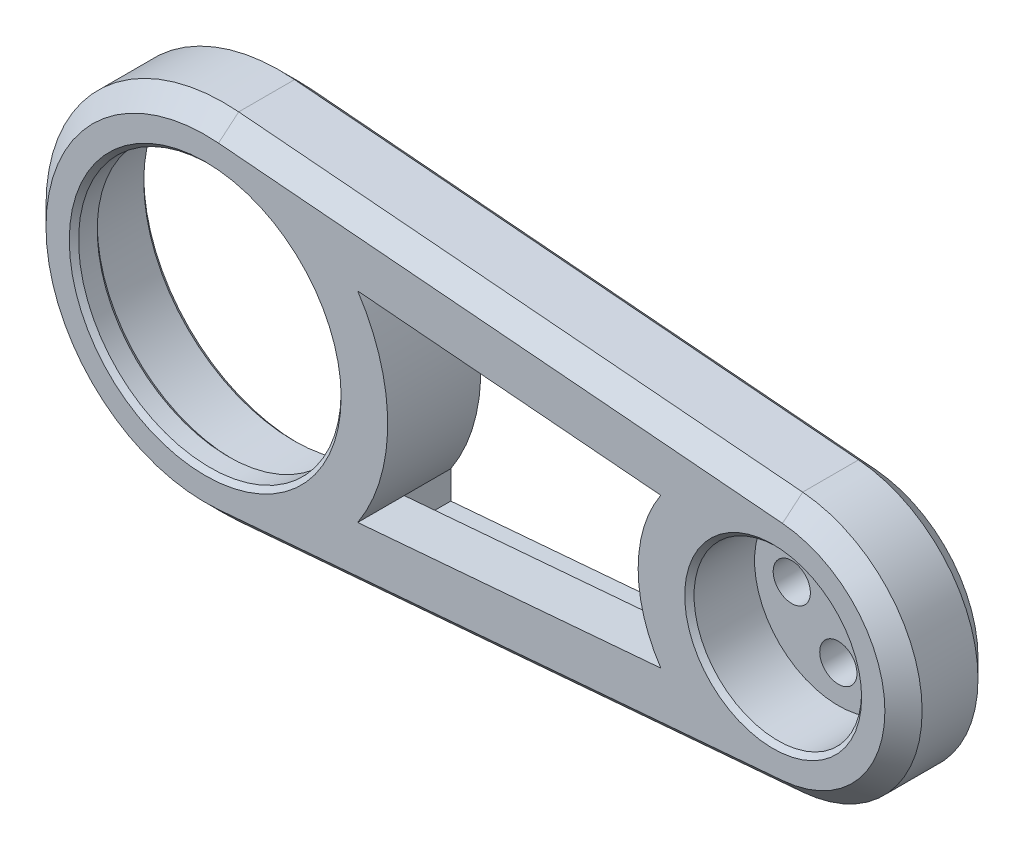
ISO-10303-21;
HEADER;
FILE_DESCRIPTION(('STEP AP214'),'2;1');
FILE_NAME('part.step','',(''),(''),'','','');
FILE_SCHEMA(('AUTOMOTIVE_DESIGN { 1 0 10303 214 1 1 1 1 }'));
ENDSEC;
DATA;
#1=APPLICATION_CONTEXT('core data for automotive mechanical design processes');
#2=APPLICATION_PROTOCOL_DEFINITION('international standard','automotive_design',2000,#1);
#3=PRODUCT_CONTEXT('',#1,'mechanical');
#4=PRODUCT('Part','Part','',(#3));
#5=PRODUCT_RELATED_PRODUCT_CATEGORY('part','',(#4));
#6=PRODUCT_DEFINITION_FORMATION('','',#4);
#7=PRODUCT_DEFINITION_CONTEXT('part definition',#1,'design');
#8=PRODUCT_DEFINITION('design','',#6,#7);
#9=PRODUCT_DEFINITION_SHAPE('','',#8);
#10=(LENGTH_UNIT() NAMED_UNIT(*) SI_UNIT(.MILLI.,.METRE.));
#11=(NAMED_UNIT(*) PLANE_ANGLE_UNIT() SI_UNIT($,.RADIAN.));
#12=(NAMED_UNIT(*) SI_UNIT($,.STERADIAN.) SOLID_ANGLE_UNIT());
#13=UNCERTAINTY_MEASURE_WITH_UNIT(LENGTH_MEASURE(1.E-05),#10,'distance_accuracy_value','');
#14=(GEOMETRIC_REPRESENTATION_CONTEXT(3) GLOBAL_UNCERTAINTY_ASSIGNED_CONTEXT((#13)) GLOBAL_UNIT_ASSIGNED_CONTEXT((#10,
#11,#12)) REPRESENTATION_CONTEXT('',''));
#15=CARTESIAN_POINT('',(0.,0.,0.));
#16=DIRECTION('',(0.,0.,1.));
#17=DIRECTION('',(1.,0.,0.));
#18=AXIS2_PLACEMENT_3D('',#15,#16,#17);
#19=CARTESIAN_POINT('',(1.01163934426229,12.0576359970411,-49.0337822898405));
#20=DIRECTION('',(0.083606557377049,0.996498842730667,0.));
#21=DIRECTION('',(-0.996498842730667,0.083606557377049,0.));
#22=AXIS2_PLACEMENT_3D('',#19,#20,#21);
#23=PLANE('',#22);
#24=DIRECTION('',(-0.996498842730667,0.083606557377049,0.));
#25=VECTOR('',#24,1.);
#26=CARTESIAN_POINT('',(1.01163934426229,12.0576359970411,-5.));
#27=LINE('',#26,#25);
#28=CARTESIAN_POINT('',(48.9312799857841,8.03716350576911,-5.));
#29=VERTEX_POINT('',#28);
#30=CARTESIAN_POINT('',(16.3767984414613,10.7684944540893,-5.));
#31=VERTEX_POINT('',#30);
#32=EDGE_CURVE('E198',#29,#31,#27,.T.);
#33=ORIENTED_EDGE('',*,*,#32,.F.);
#34=DIRECTION('',(0.,0.,1.));
#35=VECTOR('',#34,1.);
#36=CARTESIAN_POINT('',(48.9312799857841,8.03716350576912,-49.0337822898405));
#37=LINE('',#36,#35);
#38=CARTESIAN_POINT('',(48.9312799857841,8.03716350576912,0.));
#39=VERTEX_POINT('',#38);
#40=EDGE_CURVE('E253',#29,#39,#37,.T.);
#41=ORIENTED_EDGE('',*,*,#40,.T.);
#42=DIRECTION('',(-0.996498842730667,0.083606557377049,0.));
#43=VECTOR('',#42,1.);
#44=CARTESIAN_POINT('',(1.01163934426229,12.0576359970411,0.));
#45=LINE('',#44,#43);
#46=CARTESIAN_POINT('',(16.3767984414613,10.7684944540893,0.));
#47=VERTEX_POINT('',#46);
#48=EDGE_CURVE('E232',#39,#47,#45,.T.);
#49=ORIENTED_EDGE('',*,*,#48,.T.);
#50=DIRECTION('',(0.,0.,1.));
#51=VECTOR('',#50,1.);
#52=CARTESIAN_POINT('',(16.3767984414613,10.7684944540893,-49.0337822898405));
#53=LINE('',#52,#51);
#54=EDGE_CURVE('E234',#31,#47,#53,.T.);
#55=ORIENTED_EDGE('',*,*,#54,.F.);
#56=EDGE_LOOP('',(#33,#41,#49,#55));
#57=FACE_BOUND('',#56,.T.);
#58=ADVANCED_FACE('F47',(#57),#23,.F.);
#59=CARTESIAN_POINT('',(1.01163934426229,-12.0576359970411,-49.0337822898405));
#60=DIRECTION('',(0.0836065573770487,-0.996498842730667,0.));
#61=DIRECTION('',(0.996498842730667,0.0836065573770487,0.));
#62=AXIS2_PLACEMENT_3D('',#59,#60,#61);
#63=PLANE('',#62);
#64=DIRECTION('',(0.996498842730667,0.0836065573770487,0.));
#65=VECTOR('',#64,1.);
#66=CARTESIAN_POINT('',(1.01163934426229,-12.0576359970411,-5.));
#67=LINE('',#66,#65);
#68=CARTESIAN_POINT('',(16.3767984414613,-10.7684944540893,-5.));
#69=VERTEX_POINT('',#68);
#70=CARTESIAN_POINT('',(48.9312799857842,-8.03716350576914,-5.));
#71=VERTEX_POINT('',#70);
#72=EDGE_CURVE('E220',#69,#71,#67,.T.);
#73=ORIENTED_EDGE('',*,*,#72,.F.);
#74=DIRECTION('',(0.,0.,1.));
#75=VECTOR('',#74,1.);
#76=CARTESIAN_POINT('',(16.3767984414613,-10.7684944540893,-49.0337822898405));
#77=LINE('',#76,#75);
#78=CARTESIAN_POINT('',(16.3767984414613,-10.7684944540893,0.));
#79=VERTEX_POINT('',#78);
#80=EDGE_CURVE('E260',#69,#79,#77,.T.);
#81=ORIENTED_EDGE('',*,*,#80,.T.);
#82=DIRECTION('',(0.996498842730667,0.0836065573770487,0.));
#83=VECTOR('',#82,1.);
#84=CARTESIAN_POINT('',(1.01163934426229,-12.0576359970411,0.));
#85=LINE('',#84,#83);
#86=CARTESIAN_POINT('',(48.9312799857842,-8.03716350576913,0.));
#87=VERTEX_POINT('',#86);
#88=EDGE_CURVE('E233',#79,#87,#85,.T.);
#89=ORIENTED_EDGE('',*,*,#88,.T.);
#90=DIRECTION('',(0.,0.,1.));
#91=VECTOR('',#90,1.);
#92=CARTESIAN_POINT('',(48.9312799857842,-8.03716350576913,-49.0337822898405));
#93=LINE('',#92,#91);
#94=EDGE_CURVE('E237',#71,#87,#93,.T.);
#95=ORIENTED_EDGE('',*,*,#94,.F.);
#96=EDGE_LOOP('',(#73,#81,#89,#95));
#97=FACE_BOUND('',#96,.T.);
#98=ADVANCED_FACE('F434',(#97),#63,.F.);
#99=CARTESIAN_POINT('',(0.,0.,-7.));
#100=DIRECTION('',(0.,0.,1.));
#101=DIRECTION('',(1.,0.,0.));
#102=AXIS2_PLACEMENT_3D('',#99,#100,#101);
#103=CYLINDRICAL_SURFACE('',#102,16.1);
#104=CARTESIAN_POINT('',(0.,0.,-9.5));
#105=DIRECTION('',(0.,0.,-1.));
#106=DIRECTION('',(-1.,0.,0.));
#107=AXIS2_PLACEMENT_3D('',#104,#105,#106);
#108=CIRCLE('',#107,16.1);
#109=CARTESIAN_POINT('',(-16.1,0.,-9.5));
#110=VERTEX_POINT('',#109);
#111=EDGE_CURVE('E320',#110,#110,#108,.T.);
#112=ORIENTED_EDGE('',*,*,#111,.T.);
#113=EDGE_LOOP('',(#112));
#114=FACE_BOUND('',#113,.T.);
#115=CARTESIAN_POINT('',(0.,0.,-3.));
#116=DIRECTION('',(0.,0.,1.));
#117=DIRECTION('',(1.,0.,0.));
#118=AXIS2_PLACEMENT_3D('',#115,#116,#117);
#119=CIRCLE('',#118,16.1);
#120=CARTESIAN_POINT('',(16.1,0.,-3.));
#121=VERTEX_POINT('',#120);
#122=EDGE_CURVE('E295',#121,#121,#119,.F.);
#123=ORIENTED_EDGE('',*,*,#122,.F.);
#124=EDGE_LOOP('',(#123));
#125=FACE_BOUND('',#124,.T.);
#126=ADVANCED_FACE('F431',(#114,#125),#103,.F.);
#127=CARTESIAN_POINT('',(1.59688524590164,-19.0331278961557,-7.));
#128=DIRECTION('',(0.0836065573770492,-0.996498842730667,0.));
#129=DIRECTION('',(0.996498842730667,0.0836065573770492,0.));
#130=AXIS2_PLACEMENT_3D('',#127,#128,#129);
#131=PLANE('',#130);
#132=DIRECTION('',(0.,0.,1.));
#133=VECTOR('',#132,1.);
#134=CARTESIAN_POINT('',(1.59688524590164,-19.0331278961557,-7.));
#135=LINE('',#134,#133);
#136=CARTESIAN_POINT('',(1.59688524590164,-19.0331278961557,-8.00000000000003));
#137=VERTEX_POINT('',#136);
#138=CARTESIAN_POINT('',(1.59688524590164,-19.0331278961557,-2.));
#139=VERTEX_POINT('',#138);
#140=EDGE_CURVE('E293',#137,#139,#135,.T.);
#141=ORIENTED_EDGE('',*,*,#140,.F.);
#142=DIRECTION('',(0.996498842730667,0.0836065573770492,0.));
#143=VECTOR('',#142,1.);
#144=CARTESIAN_POINT('',(1.59688524590164,-19.0331278961557,-8.00000000000003));
#145=LINE('',#144,#143);
#146=CARTESIAN_POINT('',(62.1704918032787,-13.9509837982293,-8.00000000000003));
#147=VERTEX_POINT('',#146);
#148=EDGE_CURVE('E342',#137,#147,#145,.T.);
#149=ORIENTED_EDGE('',*,*,#148,.T.);
#150=DIRECTION('',(0.,0.,1.));
#151=VECTOR('',#150,1.);
#152=CARTESIAN_POINT('',(62.1704918032787,-13.9509837982293,-7.));
#153=LINE('',#152,#151);
#154=CARTESIAN_POINT('',(62.1704918032787,-13.9509837982293,-2.));
#155=VERTEX_POINT('',#154);
#156=EDGE_CURVE('E286',#147,#155,#153,.T.);
#157=ORIENTED_EDGE('',*,*,#156,.T.);
#158=DIRECTION('',(-0.996498842730667,-0.0836065573770492,0.));
#159=VECTOR('',#158,1.);
#160=CARTESIAN_POINT('',(1.59688524590164,-19.0331278961557,-2.));
#161=LINE('',#160,#159);
#162=EDGE_CURVE('E336',#155,#139,#161,.T.);
#163=ORIENTED_EDGE('',*,*,#162,.T.);
#164=EDGE_LOOP('',(#141,#149,#157,#163));
#165=FACE_BOUND('',#164,.T.);
#166=ADVANCED_FACE('F407',(#165),#131,.T.);
#167=CARTESIAN_POINT('',(0.,0.,-7.));
#168=DIRECTION('',(0.,0.,1.));
#169=DIRECTION('',(1.,0.,0.));
#170=AXIS2_PLACEMENT_3D('',#167,#168,#169);
#171=CYLINDRICAL_SURFACE('',#170,19.1);
#172=DIRECTION('',(0.,0.,1.));
#173=VECTOR('',#172,1.);
#174=CARTESIAN_POINT('',(1.59688524590164,19.0331278961557,-7.));
#175=LINE('',#174,#173);
#176=CARTESIAN_POINT('',(1.59688524590164,19.0331278961557,-8.00000000000003));
#177=VERTEX_POINT('',#176);
#178=CARTESIAN_POINT('',(1.59688524590164,19.0331278961557,-2.));
#179=VERTEX_POINT('',#178);
#180=EDGE_CURVE('E294',#177,#179,#175,.T.);
#181=ORIENTED_EDGE('',*,*,#180,.F.);
#182=CARTESIAN_POINT('',(0.,0.,-8.00000000000003));
#183=DIRECTION('',(0.,0.,-1.));
#184=DIRECTION('',(-1.,0.,0.));
#185=AXIS2_PLACEMENT_3D('',#182,#183,#184);
#186=CIRCLE('',#185,19.1);
#187=EDGE_CURVE('E347',#177,#137,#186,.F.);
#188=ORIENTED_EDGE('',*,*,#187,.T.);
#189=ORIENTED_EDGE('',*,*,#140,.T.);
#190=CARTESIAN_POINT('',(0.,0.,-2.));
#191=DIRECTION('',(0.,0.,1.));
#192=DIRECTION('',(1.,0.,0.));
#193=AXIS2_PLACEMENT_3D('',#190,#191,#192);
#194=CIRCLE('',#193,19.1);
#195=EDGE_CURVE('E341',#139,#179,#194,.F.);
#196=ORIENTED_EDGE('',*,*,#195,.T.);
#197=EDGE_LOOP('',(#181,#188,#189,#196));
#198=FACE_BOUND('',#197,.T.);
#199=ADVANCED_FACE('F421',(#198),#171,.T.);
#200=CARTESIAN_POINT('',(1.59688524590164,19.0331278961557,-7.));
#201=DIRECTION('',(-0.0836065573770492,-0.996498842730667,0.));
#202=DIRECTION('',(0.996498842730667,-0.0836065573770492,0.));
#203=AXIS2_PLACEMENT_3D('',#200,#201,#202);
#204=PLANE('',#203);
#205=DIRECTION('',(0.,0.,1.));
#206=VECTOR('',#205,1.);
#207=CARTESIAN_POINT('',(62.1704918032787,13.9509837982293,-7.));
#208=LINE('',#207,#206);
#209=CARTESIAN_POINT('',(62.1704918032787,13.9509837982293,-8.00000000000003));
#210=VERTEX_POINT('',#209);
#211=CARTESIAN_POINT('',(62.1704918032787,13.9509837982293,-2.));
#212=VERTEX_POINT('',#211);
#213=EDGE_CURVE('E296',#210,#212,#208,.T.);
#214=ORIENTED_EDGE('',*,*,#213,.F.);
#215=DIRECTION('',(-0.996498842730667,0.0836065573770492,0.));
#216=VECTOR('',#215,1.);
#217=CARTESIAN_POINT('',(1.59688524590164,19.0331278961557,-8.00000000000003));
#218=LINE('',#217,#216);
#219=EDGE_CURVE('E351',#210,#177,#218,.T.);
#220=ORIENTED_EDGE('',*,*,#219,.T.);
#221=ORIENTED_EDGE('',*,*,#180,.T.);
#222=DIRECTION('',(0.996498842730667,-0.0836065573770492,0.));
#223=VECTOR('',#222,1.);
#224=CARTESIAN_POINT('',(62.1704918032787,13.9509837982293,-2.));
#225=LINE('',#224,#223);
#226=EDGE_CURVE('E355',#179,#212,#225,.T.);
#227=ORIENTED_EDGE('',*,*,#226,.T.);
#228=EDGE_LOOP('',(#214,#220,#221,#227));
#229=FACE_BOUND('',#228,.T.);
#230=ADVANCED_FACE('F388',(#229),#204,.F.);
#231=CARTESIAN_POINT('',(61.,0.,-7.));
#232=DIRECTION('',(0.,0.,1.));
#233=DIRECTION('',(1.,0.,0.));
#234=AXIS2_PLACEMENT_3D('',#231,#232,#233);
#235=CYLINDRICAL_SURFACE('',#234,14.);
#236=ORIENTED_EDGE('',*,*,#156,.F.);
#237=CARTESIAN_POINT('',(61.,0.,-8.00000000000003));
#238=DIRECTION('',(0.,0.,-1.));
#239=DIRECTION('',(-1.,0.,0.));
#240=AXIS2_PLACEMENT_3D('',#237,#238,#239);
#241=CIRCLE('',#240,14.);
#242=EDGE_CURVE('E346',#147,#210,#241,.F.);
#243=ORIENTED_EDGE('',*,*,#242,.T.);
#244=ORIENTED_EDGE('',*,*,#213,.T.);
#245=CARTESIAN_POINT('',(61.,0.,-2.));
#246=DIRECTION('',(0.,0.,1.));
#247=DIRECTION('',(1.,0.,0.));
#248=AXIS2_PLACEMENT_3D('',#245,#246,#247);
#249=CIRCLE('',#248,14.);
#250=EDGE_CURVE('E348',#212,#155,#249,.F.);
#251=ORIENTED_EDGE('',*,*,#250,.T.);
#252=EDGE_LOOP('',(#236,#243,#244,#251));
#253=FACE_BOUND('',#252,.T.);
#254=ADVANCED_FACE('F391',(#253),#235,.T.);
#255=CARTESIAN_POINT('',(61.,0.,-7.));
#256=DIRECTION('',(0.,0.,1.));
#257=DIRECTION('',(1.,0.,0.));
#258=AXIS2_PLACEMENT_3D('',#255,#256,#257);
#259=CYLINDRICAL_SURFACE('',#258,9.00000000000001);
#260=CARTESIAN_POINT('',(61.,0.,-0.500000000000002));
#261=DIRECTION('',(0.,0.,1.));
#262=DIRECTION('',(1.,0.,0.));
#263=AXIS2_PLACEMENT_3D('',#260,#261,#262);
#264=CIRCLE('',#263,9.00000000000001);
#265=CARTESIAN_POINT('',(70.,0.,-0.500000000000002));
#266=VERTEX_POINT('',#265);
#267=EDGE_CURVE('E304',#266,#266,#264,.T.);
#268=ORIENTED_EDGE('',*,*,#267,.T.);
#269=EDGE_LOOP('',(#268));
#270=FACE_BOUND('',#269,.T.);
#271=CARTESIAN_POINT('',(61.,0.,-7.));
#272=DIRECTION('',(0.,0.,1.));
#273=DIRECTION('',(1.,0.,0.));
#274=AXIS2_PLACEMENT_3D('',#271,#272,#273);
#275=CIRCLE('',#274,9.00000000000001);
#276=CARTESIAN_POINT('',(70.,0.,-7.));
#277=VERTEX_POINT('',#276);
#278=EDGE_CURVE('E287',#277,#277,#275,.T.);
#279=ORIENTED_EDGE('',*,*,#278,.F.);
#280=EDGE_LOOP('',(#279));
#281=FACE_BOUND('',#280,.T.);
#282=ADVANCED_FACE('F485',(#270,#281),#259,.F.);
#283=CARTESIAN_POINT('',(0.,0.,0.));
#284=DIRECTION('',(0.,0.,1.));
#285=DIRECTION('',(1.,0.,0.));
#286=AXIS2_PLACEMENT_3D('',#283,#284,#285);
#287=PLANE('',#286);
#288=ORIENTED_EDGE('',*,*,#48,.F.);
#289=CARTESIAN_POINT('',(61.,0.,0.));
#290=DIRECTION('',(0.,0.,1.));
#291=DIRECTION('',(1.,0.,0.));
#292=AXIS2_PLACEMENT_3D('',#289,#290,#291);
#293=CIRCLE('',#292,14.5);
#294=EDGE_CURVE('E242',#39,#87,#293,.T.);
#295=ORIENTED_EDGE('',*,*,#294,.T.);
#296=ORIENTED_EDGE('',*,*,#88,.F.);
#297=CARTESIAN_POINT('',(0.,0.,0.));
#298=DIRECTION('',(0.,0.,1.));
#299=DIRECTION('',(1.,0.,0.));
#300=AXIS2_PLACEMENT_3D('',#297,#298,#299);
#301=CIRCLE('',#300,19.6);
#302=EDGE_CURVE('E236',#79,#47,#301,.T.);
#303=ORIENTED_EDGE('',*,*,#302,.T.);
#304=EDGE_LOOP('',(#288,#295,#296,#303));
#305=FACE_BOUND('',#304,.T.);
#306=CARTESIAN_POINT('',(0.,0.,0.));
#307=DIRECTION('',(0.,0.,1.));
#308=DIRECTION('',(1.,0.,0.));
#309=AXIS2_PLACEMENT_3D('',#306,#307,#308);
#310=CIRCLE('',#309,17.1);
#311=CARTESIAN_POINT('',(1.42967213114754,17.0401302106944,0.));
#312=VERTEX_POINT('',#311);
#313=CARTESIAN_POINT('',(1.42967213114754,-17.0401302106944,0.));
#314=VERTEX_POINT('',#313);
#315=EDGE_CURVE('E56',#312,#314,#310,.T.);
#316=ORIENTED_EDGE('',*,*,#315,.T.);
#317=DIRECTION('',(0.996498842730667,0.0836065573770492,0.));
#318=VECTOR('',#317,1.);
#319=CARTESIAN_POINT('',(1.42967213114754,-17.0401302106944,0.));
#320=LINE('',#319,#318);
#321=CARTESIAN_POINT('',(62.0032786885246,-11.957986112768,0.));
#322=VERTEX_POINT('',#321);
#323=EDGE_CURVE('E11',#314,#322,#320,.T.);
#324=ORIENTED_EDGE('',*,*,#323,.T.);
#325=CARTESIAN_POINT('',(61.,0.,0.));
#326=DIRECTION('',(0.,0.,1.));
#327=DIRECTION('',(1.,0.,0.));
#328=AXIS2_PLACEMENT_3D('',#325,#326,#327);
#329=CIRCLE('',#328,12.);
#330=CARTESIAN_POINT('',(62.0032786885246,11.957986112768,0.));
#331=VERTEX_POINT('',#330);
#332=EDGE_CURVE('E356',#322,#331,#329,.T.);
#333=ORIENTED_EDGE('',*,*,#332,.T.);
#334=DIRECTION('',(-0.996498842730667,0.0836065573770492,0.));
#335=VECTOR('',#334,1.);
#336=CARTESIAN_POINT('',(1.42967213114754,17.0401302106944,0.));
#337=LINE('',#336,#335);
#338=EDGE_CURVE('E358',#331,#312,#337,.T.);
#339=ORIENTED_EDGE('',*,*,#338,.T.);
#340=EDGE_LOOP('',(#316,#324,#333,#339));
#341=FACE_BOUND('',#340,.T.);
#342=CARTESIAN_POINT('',(61.,0.,0.));
#343=DIRECTION('',(0.,0.,1.));
#344=DIRECTION('',(1.,0.,0.));
#345=AXIS2_PLACEMENT_3D('',#342,#343,#344);
#346=CIRCLE('',#345,9.50000000000001);
#347=CARTESIAN_POINT('',(70.5,0.,0.));
#348=VERTEX_POINT('',#347);
#349=EDGE_CURVE('E311',#348,#348,#346,.F.);
#350=ORIENTED_EDGE('',*,*,#349,.T.);
#351=EDGE_LOOP('',(#350));
#352=FACE_BOUND('',#351,.T.);
#353=CARTESIAN_POINT('',(0.,0.,0.));
#354=DIRECTION('',(0.,0.,1.));
#355=DIRECTION('',(1.,0.,0.));
#356=AXIS2_PLACEMENT_3D('',#353,#354,#355);
#357=CIRCLE('',#356,14.6);
#358=CARTESIAN_POINT('',(14.6,0.,0.));
#359=VERTEX_POINT('',#358);
#360=EDGE_CURVE('E308',#359,#359,#357,.F.);
#361=ORIENTED_EDGE('',*,*,#360,.T.);
#362=EDGE_LOOP('',(#361));
#363=FACE_BOUND('',#362,.T.);
#364=ADVANCED_FACE('F479',(#305,#341,#352,#363),#287,.T.);
#365=CARTESIAN_POINT('',(0.,0.,-7.));
#366=DIRECTION('',(0.,0.,-1.));
#367=DIRECTION('',(-1.,0.,0.));
#368=AXIS2_PLACEMENT_3D('',#365,#366,#367);
#369=PLANE('',#368);
#370=CARTESIAN_POINT('',(61.,5.,-7.));
#371=DIRECTION('',(0.,0.,-1.));
#372=DIRECTION('',(-1.,0.,0.));
#373=AXIS2_PLACEMENT_3D('',#370,#371,#372);
#374=CIRCLE('',#373,2.);
#375=CARTESIAN_POINT('',(59.,5.,-7.));
#376=VERTEX_POINT('',#375);
#377=EDGE_CURVE('E261',#376,#376,#374,.F.);
#378=ORIENTED_EDGE('',*,*,#377,.F.);
#379=EDGE_LOOP('',(#378));
#380=FACE_BOUND('',#379,.T.);
#381=CARTESIAN_POINT('',(66.,0.,-7.));
#382=DIRECTION('',(0.,0.,-1.));
#383=DIRECTION('',(-1.,0.,0.));
#384=AXIS2_PLACEMENT_3D('',#381,#382,#383);
#385=CIRCLE('',#384,2.);
#386=CARTESIAN_POINT('',(64.,0.,-7.));
#387=VERTEX_POINT('',#386);
#388=EDGE_CURVE('E267',#387,#387,#385,.F.);
#389=ORIENTED_EDGE('',*,*,#388,.F.);
#390=EDGE_LOOP('',(#389));
#391=FACE_BOUND('',#390,.T.);
#392=CARTESIAN_POINT('',(61.,-5.,-7.));
#393=DIRECTION('',(0.,0.,-1.));
#394=DIRECTION('',(-1.,0.,0.));
#395=AXIS2_PLACEMENT_3D('',#392,#393,#394);
#396=CIRCLE('',#395,2.00000000000001);
#397=CARTESIAN_POINT('',(59.,-5.,-7.));
#398=VERTEX_POINT('',#397);
#399=EDGE_CURVE('E271',#398,#398,#396,.F.);
#400=ORIENTED_EDGE('',*,*,#399,.F.);
#401=EDGE_LOOP('',(#400));
#402=FACE_BOUND('',#401,.T.);
#403=CARTESIAN_POINT('',(56.,0.,-7.));
#404=DIRECTION('',(0.,0.,-1.));
#405=DIRECTION('',(-1.,0.,0.));
#406=AXIS2_PLACEMENT_3D('',#403,#404,#405);
#407=CIRCLE('',#406,2.);
#408=CARTESIAN_POINT('',(54.,0.,-7.));
#409=VERTEX_POINT('',#408);
#410=EDGE_CURVE('E276',#409,#409,#407,.F.);
#411=ORIENTED_EDGE('',*,*,#410,.F.);
#412=EDGE_LOOP('',(#411));
#413=FACE_BOUND('',#412,.T.);
#414=ORIENTED_EDGE('',*,*,#278,.T.);
#415=EDGE_LOOP('',(#414));
#416=FACE_BOUND('',#415,.T.);
#417=ADVANCED_FACE('F473',(#380,#391,#402,#413,#416),#369,.F.);
#418=CARTESIAN_POINT('',(0.,0.,-10.));
#419=DIRECTION('',(0.,0.,-1.));
#420=DIRECTION('',(-1.,0.,0.));
#421=AXIS2_PLACEMENT_3D('',#418,#419,#420);
#422=PLANE('',#421);
#423=DIRECTION('',(0.,-1.,0.));
#424=VECTOR('',#423,1.);
#425=CARTESIAN_POINT('',(48.9312799857841,0.,-10.));
#426=LINE('',#425,#424);
#427=CARTESIAN_POINT('',(48.9312799857841,11.0477038810888,-10.));
#428=VERTEX_POINT('',#427);
#429=CARTESIAN_POINT('',(48.9312799857841,8.03716350576911,-10.));
#430=VERTEX_POINT('',#429);
#431=EDGE_CURVE('E201',#428,#430,#426,.T.);
#432=ORIENTED_EDGE('',*,*,#431,.F.);
#433=DIRECTION('',(-0.996498842730667,0.0836065573770492,0.));
#434=VECTOR('',#433,1.);
#435=CARTESIAN_POINT('',(1.26245901639344,15.0471325252331,-10.));
#436=LINE('',#435,#434);
#437=CARTESIAN_POINT('',(16.3767984414613,13.779034829409,-10.));
#438=VERTEX_POINT('',#437);
#439=EDGE_CURVE('E181',#428,#438,#436,.T.);
#440=ORIENTED_EDGE('',*,*,#439,.T.);
#441=DIRECTION('',(0.,-1.,0.));
#442=VECTOR('',#441,1.);
#443=CARTESIAN_POINT('',(16.3767984414613,0.,-10.));
#444=LINE('',#443,#442);
#445=CARTESIAN_POINT('',(16.3767984414613,10.7684944540893,-10.));
#446=VERTEX_POINT('',#445);
#447=EDGE_CURVE('E194',#438,#446,#444,.T.);
#448=ORIENTED_EDGE('',*,*,#447,.T.);
#449=CARTESIAN_POINT('',(0.,0.,-10.));
#450=DIRECTION('',(0.,0.,-1.));
#451=DIRECTION('',(-1.,0.,0.));
#452=AXIS2_PLACEMENT_3D('',#449,#450,#451);
#453=CIRCLE('',#452,19.6);
#454=CARTESIAN_POINT('',(16.3767984414613,-10.7684944540893,-10.));
#455=VERTEX_POINT('',#454);
#456=EDGE_CURVE('E243',#455,#446,#453,.F.);
#457=ORIENTED_EDGE('',*,*,#456,.F.);
#458=DIRECTION('',(0.,1.,0.));
#459=VECTOR('',#458,1.);
#460=CARTESIAN_POINT('',(16.3767984414613,0.,-10.));
#461=LINE('',#460,#459);
#462=CARTESIAN_POINT('',(16.3767984414613,-13.779034829409,-10.));
#463=VERTEX_POINT('',#462);
#464=EDGE_CURVE('E228',#463,#455,#461,.T.);
#465=ORIENTED_EDGE('',*,*,#464,.F.);
#466=DIRECTION('',(-0.996498842730667,-0.0836065573770486,0.));
#467=VECTOR('',#466,1.);
#468=CARTESIAN_POINT('',(1.26245901639343,-15.047132525233,-10.));
#469=LINE('',#468,#467);
#470=CARTESIAN_POINT('',(48.9312799857842,-11.0477038810888,-10.));
#471=VERTEX_POINT('',#470);
#472=EDGE_CURVE('E224',#471,#463,#469,.T.);
#473=ORIENTED_EDGE('',*,*,#472,.F.);
#474=DIRECTION('',(0.,1.,0.));
#475=VECTOR('',#474,1.);
#476=CARTESIAN_POINT('',(48.9312799857842,0.,-10.));
#477=LINE('',#476,#475);
#478=CARTESIAN_POINT('',(48.9312799857842,-8.03716350576914,-10.));
#479=VERTEX_POINT('',#478);
#480=EDGE_CURVE('E73',#471,#479,#477,.T.);
#481=ORIENTED_EDGE('',*,*,#480,.T.);
#482=CARTESIAN_POINT('',(61.,0.,-10.));
#483=DIRECTION('',(0.,0.,-1.));
#484=DIRECTION('',(-1.,0.,0.));
#485=AXIS2_PLACEMENT_3D('',#482,#483,#484);
#486=CIRCLE('',#485,14.5);
#487=EDGE_CURVE('E209',#430,#479,#486,.F.);
#488=ORIENTED_EDGE('',*,*,#487,.F.);
#489=EDGE_LOOP('',(#432,#440,#448,#457,#465,#473,#481,#488));
#490=FACE_BOUND('',#489,.T.);
#491=CARTESIAN_POINT('',(61.,5.,-10.));
#492=DIRECTION('',(0.,0.,-1.));
#493=DIRECTION('',(-1.,0.,0.));
#494=AXIS2_PLACEMENT_3D('',#491,#492,#493);
#495=CIRCLE('',#494,2.);
#496=CARTESIAN_POINT('',(59.,5.,-10.));
#497=VERTEX_POINT('',#496);
#498=EDGE_CURVE('E265',#497,#497,#495,.T.);
#499=ORIENTED_EDGE('',*,*,#498,.F.);
#500=EDGE_LOOP('',(#499));
#501=FACE_BOUND('',#500,.T.);
#502=CARTESIAN_POINT('',(66.,0.,-10.));
#503=DIRECTION('',(0.,0.,-1.));
#504=DIRECTION('',(-1.,0.,0.));
#505=AXIS2_PLACEMENT_3D('',#502,#503,#504);
#506=CIRCLE('',#505,2.);
#507=CARTESIAN_POINT('',(64.,0.,-10.));
#508=VERTEX_POINT('',#507);
#509=EDGE_CURVE('E268',#508,#508,#506,.T.);
#510=ORIENTED_EDGE('',*,*,#509,.F.);
#511=EDGE_LOOP('',(#510));
#512=FACE_BOUND('',#511,.T.);
#513=CARTESIAN_POINT('',(61.,-5.,-10.));
#514=DIRECTION('',(0.,0.,-1.));
#515=DIRECTION('',(-1.,0.,0.));
#516=AXIS2_PLACEMENT_3D('',#513,#514,#515);
#517=CIRCLE('',#516,2.00000000000001);
#518=CARTESIAN_POINT('',(59.,-5.,-10.));
#519=VERTEX_POINT('',#518);
#520=EDGE_CURVE('E277',#519,#519,#517,.T.);
#521=ORIENTED_EDGE('',*,*,#520,.F.);
#522=EDGE_LOOP('',(#521));
#523=FACE_BOUND('',#522,.T.);
#524=CARTESIAN_POINT('',(56.,0.,-10.));
#525=DIRECTION('',(0.,0.,-1.));
#526=DIRECTION('',(-1.,0.,0.));
#527=AXIS2_PLACEMENT_3D('',#524,#525,#526);
#528=CIRCLE('',#527,2.);
#529=CARTESIAN_POINT('',(54.,0.,-10.));
#530=VERTEX_POINT('',#529);
#531=EDGE_CURVE('E250',#530,#530,#528,.T.);
#532=ORIENTED_EDGE('',*,*,#531,.F.);
#533=EDGE_LOOP('',(#532));
#534=FACE_BOUND('',#533,.T.);
#535=CARTESIAN_POINT('',(61.,0.,-10.));
#536=DIRECTION('',(0.,0.,-1.));
#537=DIRECTION('',(-1.,0.,0.));
#538=AXIS2_PLACEMENT_3D('',#535,#536,#537);
#539=CIRCLE('',#538,12.0000000000001);
#540=CARTESIAN_POINT('',(62.0032786885246,11.957986112768,-10.));
#541=VERTEX_POINT('',#540);
#542=CARTESIAN_POINT('',(62.0032786885246,-11.9579861127681,-10.));
#543=VERTEX_POINT('',#542);
#544=EDGE_CURVE('E332',#541,#543,#539,.T.);
#545=ORIENTED_EDGE('',*,*,#544,.T.);
#546=DIRECTION('',(-0.996498842730667,-0.0836065573770492,0.));
#547=VECTOR('',#546,1.);
#548=CARTESIAN_POINT('',(1.42967213114754,-17.0401302106944,-10.));
#549=LINE('',#548,#547);
#550=CARTESIAN_POINT('',(1.42967213114754,-17.0401302106944,-10.));
#551=VERTEX_POINT('',#550);
#552=EDGE_CURVE('E333',#543,#551,#549,.T.);
#553=ORIENTED_EDGE('',*,*,#552,.T.);
#554=CARTESIAN_POINT('',(0.,0.,-10.));
#555=DIRECTION('',(0.,0.,-1.));
#556=DIRECTION('',(-1.,0.,0.));
#557=AXIS2_PLACEMENT_3D('',#554,#555,#556);
#558=CIRCLE('',#557,17.1);
#559=CARTESIAN_POINT('',(1.42967213114754,17.0401302106944,-10.));
#560=VERTEX_POINT('',#559);
#561=EDGE_CURVE('E334',#551,#560,#558,.T.);
#562=ORIENTED_EDGE('',*,*,#561,.T.);
#563=DIRECTION('',(0.996498842730667,-0.0836065573770492,0.));
#564=VECTOR('',#563,1.);
#565=CARTESIAN_POINT('',(62.0032786885246,11.957986112768,-10.));
#566=LINE('',#565,#564);
#567=EDGE_CURVE('E329',#560,#541,#566,.T.);
#568=ORIENTED_EDGE('',*,*,#567,.T.);
#569=EDGE_LOOP('',(#545,#553,#562,#568));
#570=FACE_BOUND('',#569,.T.);
#571=CARTESIAN_POINT('',(0.,0.,-10.));
#572=DIRECTION('',(0.,0.,-1.));
#573=DIRECTION('',(-1.,0.,0.));
#574=AXIS2_PLACEMENT_3D('',#571,#572,#573);
#575=CIRCLE('',#574,16.6);
#576=CARTESIAN_POINT('',(-16.6,0.,-10.));
#577=VERTEX_POINT('',#576);
#578=EDGE_CURVE('E313',#577,#577,#575,.F.);
#579=ORIENTED_EDGE('',*,*,#578,.T.);
#580=EDGE_LOOP('',(#579));
#581=FACE_BOUND('',#580,.T.);
#582=ADVANCED_FACE('F419',(#490,#501,#512,#523,#534,#570,#581),#422,.T.);
#583=CARTESIAN_POINT('',(0.,0.,-3.));
#584=DIRECTION('',(0.,0.,1.));
#585=DIRECTION('',(1.,0.,0.));
#586=AXIS2_PLACEMENT_3D('',#583,#584,#585);
#587=PLANE('',#586);
#588=CARTESIAN_POINT('',(0.,0.,-3.));
#589=DIRECTION('',(0.,0.,1.));
#590=DIRECTION('',(1.,0.,0.));
#591=AXIS2_PLACEMENT_3D('',#588,#589,#590);
#592=CIRCLE('',#591,14.6);
#593=CARTESIAN_POINT('',(14.6,0.,-3.));
#594=VERTEX_POINT('',#593);
#595=EDGE_CURVE('E318',#594,#594,#592,.T.);
#596=ORIENTED_EDGE('',*,*,#595,.T.);
#597=EDGE_LOOP('',(#596));
#598=FACE_BOUND('',#597,.T.);
#599=ORIENTED_EDGE('',*,*,#122,.T.);
#600=EDGE_LOOP('',(#599));
#601=FACE_BOUND('',#600,.T.);
#602=ADVANCED_FACE('F466',(#598,#601),#587,.F.);
#603=CARTESIAN_POINT('',(0.,0.,-3.));
#604=DIRECTION('',(0.,0.,1.));
#605=DIRECTION('',(1.,0.,0.));
#606=AXIS2_PLACEMENT_3D('',#603,#604,#605);
#607=CYLINDRICAL_SURFACE('',#606,14.1);
#608=CARTESIAN_POINT('',(0.,0.,-2.50000000000001));
#609=DIRECTION('',(0.,0.,1.));
#610=DIRECTION('',(1.,0.,0.));
#611=AXIS2_PLACEMENT_3D('',#608,#609,#610);
#612=CIRCLE('',#611,14.1);
#613=CARTESIAN_POINT('',(14.1,0.,-2.50000000000001));
#614=VERTEX_POINT('',#613);
#615=EDGE_CURVE('E327',#614,#614,#612,.F.);
#616=ORIENTED_EDGE('',*,*,#615,.T.);
#617=EDGE_LOOP('',(#616));
#618=FACE_BOUND('',#617,.T.);
#619=CARTESIAN_POINT('',(0.,0.,-0.500000000000009));
#620=DIRECTION('',(0.,0.,1.));
#621=DIRECTION('',(1.,0.,0.));
#622=AXIS2_PLACEMENT_3D('',#619,#620,#621);
#623=CIRCLE('',#622,14.1);
#624=CARTESIAN_POINT('',(14.1,0.,-0.500000000000009));
#625=VERTEX_POINT('',#624);
#626=EDGE_CURVE('E324',#625,#625,#623,.T.);
#627=ORIENTED_EDGE('',*,*,#626,.T.);
#628=EDGE_LOOP('',(#627));
#629=FACE_BOUND('',#628,.T.);
#630=ADVANCED_FACE('F461',(#618,#629),#607,.F.);
#631=CARTESIAN_POINT('',(61.,0.,-0.500000000000002));
#632=DIRECTION('',(0.,0.,1.));
#633=DIRECTION('',(1.,0.,0.));
#634=AXIS2_PLACEMENT_3D('',#631,#632,#633);
#635=CONICAL_SURFACE('',#634,9.00000000000001,0.785398163397445);
#636=ORIENTED_EDGE('',*,*,#349,.F.);
#637=EDGE_LOOP('',(#636));
#638=FACE_BOUND('',#637,.T.);
#639=ORIENTED_EDGE('',*,*,#267,.F.);
#640=EDGE_LOOP('',(#639));
#641=FACE_BOUND('',#640,.T.);
#642=ADVANCED_FACE('F470',(#638,#641),#635,.F.);
#643=CARTESIAN_POINT('',(0.,0.,-10.));
#644=DIRECTION('',(0.,0.,-1.));
#645=DIRECTION('',(-1.,0.,0.));
#646=AXIS2_PLACEMENT_3D('',#643,#644,#645);
#647=CONICAL_SURFACE('',#646,16.6,0.785398163397448);
#648=ORIENTED_EDGE('',*,*,#111,.F.);
#649=EDGE_LOOP('',(#648));
#650=FACE_BOUND('',#649,.T.);
#651=ORIENTED_EDGE('',*,*,#578,.F.);
#652=EDGE_LOOP('',(#651));
#653=FACE_BOUND('',#652,.T.);
#654=ADVANCED_FACE('F492',(#650,#653),#647,.F.);
#655=CARTESIAN_POINT('',(0.,0.,-3.));
#656=DIRECTION('',(0.,0.,-1.));
#657=DIRECTION('',(-1.,0.,0.));
#658=AXIS2_PLACEMENT_3D('',#655,#656,#657);
#659=CONICAL_SURFACE('',#658,14.6,0.785398163397441);
#660=ORIENTED_EDGE('',*,*,#615,.F.);
#661=EDGE_LOOP('',(#660));
#662=FACE_BOUND('',#661,.T.);
#663=ORIENTED_EDGE('',*,*,#595,.F.);
#664=EDGE_LOOP('',(#663));
#665=FACE_BOUND('',#664,.T.);
#666=ADVANCED_FACE('F498',(#662,#665),#659,.F.);
#667=CARTESIAN_POINT('',(0.,0.,-0.500000000000009));
#668=DIRECTION('',(0.,0.,1.));
#669=DIRECTION('',(1.,0.,0.));
#670=AXIS2_PLACEMENT_3D('',#667,#668,#669);
#671=CONICAL_SURFACE('',#670,14.1,0.785398163397455);
#672=ORIENTED_EDGE('',*,*,#360,.F.);
#673=EDGE_LOOP('',(#672));
#674=FACE_BOUND('',#673,.T.);
#675=ORIENTED_EDGE('',*,*,#626,.F.);
#676=EDGE_LOOP('',(#675));
#677=FACE_BOUND('',#676,.T.);
#678=ADVANCED_FACE('F504',(#674,#677),#671,.F.);
#679=CARTESIAN_POINT('',(1.42967213114754,17.0401302106944,-10.));
#680=DIRECTION('',(0.0591187636729736,0.704631089139401,-0.707106781186548));
#681=DIRECTION('',(-0.996498842730667,0.0836065573770492,0.));
#682=AXIS2_PLACEMENT_3D('',#679,#680,#681);
#683=PLANE('',#682);
#684=DIRECTION('',(-0.0591187636729737,-0.704631089139402,-0.707106781186547));
#685=VECTOR('',#684,1.);
#686=CARTESIAN_POINT('',(1.59688524590164,19.0331278961557,-8.00000000000003));
#687=LINE('',#686,#685);
#688=EDGE_CURVE('E362',#177,#560,#687,.T.);
#689=ORIENTED_EDGE('',*,*,#688,.F.);
#690=ORIENTED_EDGE('',*,*,#219,.F.);
#691=DIRECTION('',(0.059118763672973,0.704631089139402,0.707106781186547));
#692=VECTOR('',#691,1.);
#693=CARTESIAN_POINT('',(62.0032786885246,11.957986112768,-10.));
#694=LINE('',#693,#692);
#695=EDGE_CURVE('E288',#541,#210,#694,.T.);
#696=ORIENTED_EDGE('',*,*,#695,.F.);
#697=ORIENTED_EDGE('',*,*,#567,.F.);
#698=EDGE_LOOP('',(#689,#690,#696,#697));
#699=FACE_BOUND('',#698,.T.);
#700=ADVANCED_FACE('F423',(#699),#683,.T.);
#701=CARTESIAN_POINT('',(61.,0.,-10.));
#702=DIRECTION('',(0.,0.,1.));
#703=DIRECTION('',(1.,0.,0.));
#704=AXIS2_PLACEMENT_3D('',#701,#702,#703);
#705=CONICAL_SURFACE('',#704,12.0000000000001,0.785398163397448);
#706=ORIENTED_EDGE('',*,*,#695,.T.);
#707=ORIENTED_EDGE('',*,*,#242,.F.);
#708=DIRECTION('',(0.059118763672973,-0.704631089139402,0.707106781186547));
#709=VECTOR('',#708,1.);
#710=CARTESIAN_POINT('',(62.0032786885246,-11.9579861127681,-10.));
#711=LINE('',#710,#709);
#712=EDGE_CURVE('E361',#543,#147,#711,.T.);
#713=ORIENTED_EDGE('',*,*,#712,.F.);
#714=ORIENTED_EDGE('',*,*,#544,.F.);
#715=EDGE_LOOP('',(#706,#707,#713,#714));
#716=FACE_BOUND('',#715,.T.);
#717=ADVANCED_FACE('F396',(#716),#705,.T.);
#718=CARTESIAN_POINT('',(0.,0.,-10.));
#719=DIRECTION('',(0.,0.,1.));
#720=DIRECTION('',(1.,0.,0.));
#721=AXIS2_PLACEMENT_3D('',#718,#719,#720);
#722=CONICAL_SURFACE('',#721,17.1,0.785398163397448);
#723=ORIENTED_EDGE('',*,*,#688,.T.);
#724=ORIENTED_EDGE('',*,*,#561,.F.);
#725=DIRECTION('',(-0.0591187636729736,0.704631089139401,-0.707106781186548));
#726=VECTOR('',#725,1.);
#727=CARTESIAN_POINT('',(1.59688524590164,-19.0331278961557,-8.00000000000003));
#728=LINE('',#727,#726);
#729=EDGE_CURVE('E363',#137,#551,#728,.T.);
#730=ORIENTED_EDGE('',*,*,#729,.F.);
#731=ORIENTED_EDGE('',*,*,#187,.F.);
#732=EDGE_LOOP('',(#723,#724,#730,#731));
#733=FACE_BOUND('',#732,.T.);
#734=ADVANCED_FACE('F414',(#733),#722,.T.);
#735=CARTESIAN_POINT('',(1.42967213114754,-17.0401302106944,-10.));
#736=DIRECTION('',(-0.0591187636729736,0.704631089139401,0.707106781186548));
#737=DIRECTION('',(-0.996498842730667,-0.0836065573770492,0.));
#738=AXIS2_PLACEMENT_3D('',#735,#736,#737);
#739=PLANE('',#738);
#740=ORIENTED_EDGE('',*,*,#712,.T.);
#741=ORIENTED_EDGE('',*,*,#148,.F.);
#742=ORIENTED_EDGE('',*,*,#729,.T.);
#743=ORIENTED_EDGE('',*,*,#552,.F.);
#744=EDGE_LOOP('',(#740,#741,#742,#743));
#745=FACE_BOUND('',#744,.T.);
#746=ADVANCED_FACE('F408',(#745),#739,.F.);
#747=CARTESIAN_POINT('',(1.59688524590164,19.0331278961557,-2.));
#748=DIRECTION('',(0.0591187636729734,0.704631089139399,0.70710678118655));
#749=DIRECTION('',(-0.996498842730667,0.0836065573770492,0.));
#750=AXIS2_PLACEMENT_3D('',#747,#748,#749);
#751=PLANE('',#750);
#752=DIRECTION('',(-0.0591187636729745,-0.704631089139404,0.707106781186545));
#753=VECTOR('',#752,1.);
#754=CARTESIAN_POINT('',(62.1704918032787,13.9509837982293,-2.));
#755=LINE('',#754,#753);
#756=EDGE_CURVE('E375',#212,#331,#755,.T.);
#757=ORIENTED_EDGE('',*,*,#756,.F.);
#758=ORIENTED_EDGE('',*,*,#226,.F.);
#759=DIRECTION('',(0.0591187636729738,0.704631089139404,-0.707106781186545));
#760=VECTOR('',#759,1.);
#761=CARTESIAN_POINT('',(1.42967213114754,17.0401302106944,0.));
#762=LINE('',#761,#760);
#763=EDGE_CURVE('E53',#312,#179,#762,.T.);
#764=ORIENTED_EDGE('',*,*,#763,.F.);
#765=ORIENTED_EDGE('',*,*,#338,.F.);
#766=EDGE_LOOP('',(#757,#758,#764,#765));
#767=FACE_BOUND('',#766,.T.);
#768=ADVANCED_FACE('F55',(#767),#751,.T.);
#769=CARTESIAN_POINT('',(0.,0.,0.));
#770=DIRECTION('',(0.,0.,-1.));
#771=DIRECTION('',(-1.,0.,0.));
#772=AXIS2_PLACEMENT_3D('',#769,#770,#771);
#773=CONICAL_SURFACE('',#772,17.1,0.785398163397452);
#774=ORIENTED_EDGE('',*,*,#763,.T.);
#775=ORIENTED_EDGE('',*,*,#195,.F.);
#776=DIRECTION('',(0.0591187636729739,-0.704631089139403,-0.707106781186545));
#777=VECTOR('',#776,1.);
#778=CARTESIAN_POINT('',(1.42967213114754,-17.0401302106944,0.));
#779=LINE('',#778,#777);
#780=EDGE_CURVE('E371',#314,#139,#779,.T.);
#781=ORIENTED_EDGE('',*,*,#780,.F.);
#782=ORIENTED_EDGE('',*,*,#315,.F.);
#783=EDGE_LOOP('',(#774,#775,#781,#782));
#784=FACE_BOUND('',#783,.T.);
#785=ADVANCED_FACE('F384',(#784),#773,.T.);
#786=CARTESIAN_POINT('',(61.,0.,0.));
#787=DIRECTION('',(0.,0.,-1.));
#788=DIRECTION('',(-1.,0.,0.));
#789=AXIS2_PLACEMENT_3D('',#786,#787,#788);
#790=CONICAL_SURFACE('',#789,12.,0.785398163397452);
#791=ORIENTED_EDGE('',*,*,#756,.T.);
#792=ORIENTED_EDGE('',*,*,#332,.F.);
#793=DIRECTION('',(-0.0591187636729745,0.704631089139404,0.707106781186545));
#794=VECTOR('',#793,1.);
#795=CARTESIAN_POINT('',(62.1704918032787,-13.9509837982294,-2.));
#796=LINE('',#795,#794);
#797=EDGE_CURVE('E266',#155,#322,#796,.T.);
#798=ORIENTED_EDGE('',*,*,#797,.F.);
#799=ORIENTED_EDGE('',*,*,#250,.F.);
#800=EDGE_LOOP('',(#791,#792,#798,#799));
#801=FACE_BOUND('',#800,.T.);
#802=ADVANCED_FACE('F548',(#801),#790,.T.);
#803=CARTESIAN_POINT('',(1.42967213114754,-17.0401302106944,0.));
#804=DIRECTION('',(-0.0591187636729734,0.704631089139399,-0.70710678118655));
#805=DIRECTION('',(0.996498842730667,0.0836065573770492,0.));
#806=AXIS2_PLACEMENT_3D('',#803,#804,#805);
#807=PLANE('',#806);
#808=ORIENTED_EDGE('',*,*,#780,.T.);
#809=ORIENTED_EDGE('',*,*,#162,.F.);
#810=ORIENTED_EDGE('',*,*,#797,.T.);
#811=ORIENTED_EDGE('',*,*,#323,.F.);
#812=EDGE_LOOP('',(#808,#809,#810,#811));
#813=FACE_BOUND('',#812,.T.);
#814=ADVANCED_FACE('F465',(#813),#807,.F.);
#815=CARTESIAN_POINT('',(56.,0.,-1.34314575050759));
#816=DIRECTION('',(0.,0.,-1.));
#817=DIRECTION('',(-1.,0.,0.));
#818=AXIS2_PLACEMENT_3D('',#815,#816,#817);
#819=CYLINDRICAL_SURFACE('',#818,2.);
#820=ORIENTED_EDGE('',*,*,#410,.T.);
#821=EDGE_LOOP('',(#820));
#822=FACE_BOUND('',#821,.T.);
#823=ORIENTED_EDGE('',*,*,#531,.T.);
#824=EDGE_LOOP('',(#823));
#825=FACE_BOUND('',#824,.T.);
#826=ADVANCED_FACE('F458',(#822,#825),#819,.F.);
#827=CARTESIAN_POINT('',(61.,-5.,-1.34314575050759));
#828=DIRECTION('',(0.,0.,-1.));
#829=DIRECTION('',(-1.,0.,0.));
#830=AXIS2_PLACEMENT_3D('',#827,#828,#829);
#831=CYLINDRICAL_SURFACE('',#830,2.00000000000001);
#832=ORIENTED_EDGE('',*,*,#399,.T.);
#833=EDGE_LOOP('',(#832));
#834=FACE_BOUND('',#833,.T.);
#835=ORIENTED_EDGE('',*,*,#520,.T.);
#836=EDGE_LOOP('',(#835));
#837=FACE_BOUND('',#836,.T.);
#838=ADVANCED_FACE('F451',(#834,#837),#831,.F.);
#839=CARTESIAN_POINT('',(66.,0.,-1.34314575050759));
#840=DIRECTION('',(0.,0.,-1.));
#841=DIRECTION('',(-1.,0.,0.));
#842=AXIS2_PLACEMENT_3D('',#839,#840,#841);
#843=CYLINDRICAL_SURFACE('',#842,2.);
#844=ORIENTED_EDGE('',*,*,#388,.T.);
#845=EDGE_LOOP('',(#844));
#846=FACE_BOUND('',#845,.T.);
#847=ORIENTED_EDGE('',*,*,#509,.T.);
#848=EDGE_LOOP('',(#847));
#849=FACE_BOUND('',#848,.T.);
#850=ADVANCED_FACE('F448',(#846,#849),#843,.F.);
#851=CARTESIAN_POINT('',(61.,5.,-1.34314575050759));
#852=DIRECTION('',(0.,0.,-1.));
#853=DIRECTION('',(-1.,0.,0.));
#854=AXIS2_PLACEMENT_3D('',#851,#852,#853);
#855=CYLINDRICAL_SURFACE('',#854,2.);
#856=ORIENTED_EDGE('',*,*,#377,.T.);
#857=EDGE_LOOP('',(#856));
#858=FACE_BOUND('',#857,.T.);
#859=ORIENTED_EDGE('',*,*,#498,.T.);
#860=EDGE_LOOP('',(#859));
#861=FACE_BOUND('',#860,.T.);
#862=ADVANCED_FACE('F450',(#858,#861),#855,.F.);
#863=CARTESIAN_POINT('',(0.,0.,-49.0337822898405));
#864=DIRECTION('',(0.,0.,1.));
#865=DIRECTION('',(1.,0.,0.));
#866=AXIS2_PLACEMENT_3D('',#863,#864,#865);
#867=CYLINDRICAL_SURFACE('',#866,19.6);
#868=ORIENTED_EDGE('',*,*,#456,.T.);
#869=EDGE_CURVE('E259',#446,#31,#53,.T.);
#870=ORIENTED_EDGE('',*,*,#869,.T.);
#871=ORIENTED_EDGE('',*,*,#54,.T.);
#872=ORIENTED_EDGE('',*,*,#302,.F.);
#873=ORIENTED_EDGE('',*,*,#80,.F.);
#874=EDGE_CURVE('E239',#455,#69,#77,.T.);
#875=ORIENTED_EDGE('',*,*,#874,.F.);
#876=EDGE_LOOP('',(#868,#870,#871,#872,#873,#875));
#877=FACE_BOUND('',#876,.T.);
#878=ADVANCED_FACE('F447',(#877),#867,.T.);
#879=CARTESIAN_POINT('',(61.,0.,-49.0337822898405));
#880=DIRECTION('',(0.,0.,1.));
#881=DIRECTION('',(1.,0.,0.));
#882=AXIS2_PLACEMENT_3D('',#879,#880,#881);
#883=CYLINDRICAL_SURFACE('',#882,14.5);
#884=ORIENTED_EDGE('',*,*,#487,.T.);
#885=EDGE_CURVE('E255',#479,#71,#93,.T.);
#886=ORIENTED_EDGE('',*,*,#885,.T.);
#887=ORIENTED_EDGE('',*,*,#94,.T.);
#888=ORIENTED_EDGE('',*,*,#294,.F.);
#889=ORIENTED_EDGE('',*,*,#40,.F.);
#890=EDGE_CURVE('E200',#430,#29,#37,.T.);
#891=ORIENTED_EDGE('',*,*,#890,.F.);
#892=EDGE_LOOP('',(#884,#886,#887,#888,#889,#891));
#893=FACE_BOUND('',#892,.T.);
#894=ADVANCED_FACE('F738',(#893),#883,.T.);
#895=CARTESIAN_POINT('',(1.26245901639343,-15.047132525233,-5.));
#896=DIRECTION('',(0.0836065573770486,-0.996498842730667,0.));
#897=DIRECTION('',(0.996498842730667,0.0836065573770486,0.));
#898=AXIS2_PLACEMENT_3D('',#895,#896,#897);
#899=PLANE('',#898);
#900=ORIENTED_EDGE('',*,*,#472,.T.);
#901=DIRECTION('',(0.,0.,-1.));
#902=VECTOR('',#901,1.);
#903=CARTESIAN_POINT('',(16.3767984414613,-13.779034829409,-5.));
#904=LINE('',#903,#902);
#905=CARTESIAN_POINT('',(16.3767984414613,-13.779034829409,-5.));
#906=VERTEX_POINT('',#905);
#907=EDGE_CURVE('E225',#906,#463,#904,.T.);
#908=ORIENTED_EDGE('',*,*,#907,.F.);
#909=DIRECTION('',(-0.996498842730667,-0.0836065573770486,0.));
#910=VECTOR('',#909,1.);
#911=CARTESIAN_POINT('',(1.26245901639343,-15.047132525233,-5.));
#912=LINE('',#911,#910);
#913=CARTESIAN_POINT('',(48.9312799857842,-11.0477038810888,-5.));
#914=VERTEX_POINT('',#913);
#915=EDGE_CURVE('E212',#914,#906,#912,.T.);
#916=ORIENTED_EDGE('',*,*,#915,.F.);
#917=DIRECTION('',(0.,0.,-1.));
#918=VECTOR('',#917,1.);
#919=CARTESIAN_POINT('',(48.9312799857842,-11.0477038810888,-5.));
#920=LINE('',#919,#918);
#921=EDGE_CURVE('E203',#914,#471,#920,.T.);
#922=ORIENTED_EDGE('',*,*,#921,.T.);
#923=EDGE_LOOP('',(#900,#908,#916,#922));
#924=FACE_BOUND('',#923,.T.);
#925=ADVANCED_FACE('F747',(#924),#899,.F.);
#926=CARTESIAN_POINT('',(48.9312799857842,0.,-5.));
#927=DIRECTION('',(-1.,0.,0.));
#928=DIRECTION('',(0.,0.,1.));
#929=AXIS2_PLACEMENT_3D('',#926,#927,#928);
#930=PLANE('',#929);
#931=ORIENTED_EDGE('',*,*,#480,.F.);
#932=ORIENTED_EDGE('',*,*,#921,.F.);
#933=DIRECTION('',(0.,1.,0.));
#934=VECTOR('',#933,1.);
#935=CARTESIAN_POINT('',(48.9312799857842,0.,-5.));
#936=LINE('',#935,#934);
#937=EDGE_CURVE('E216',#914,#71,#936,.T.);
#938=ORIENTED_EDGE('',*,*,#937,.T.);
#939=ORIENTED_EDGE('',*,*,#885,.F.);
#940=EDGE_LOOP('',(#931,#932,#938,#939));
#941=FACE_BOUND('',#940,.T.);
#942=ADVANCED_FACE('F766',(#941),#930,.T.);
#943=CARTESIAN_POINT('',(16.3767984414613,0.,-5.));
#944=DIRECTION('',(-1.,0.,0.));
#945=DIRECTION('',(0.,0.,1.));
#946=AXIS2_PLACEMENT_3D('',#943,#944,#945);
#947=PLANE('',#946);
#948=ORIENTED_EDGE('',*,*,#464,.T.);
#949=ORIENTED_EDGE('',*,*,#874,.T.);
#950=DIRECTION('',(0.,1.,0.));
#951=VECTOR('',#950,1.);
#952=CARTESIAN_POINT('',(16.3767984414613,0.,-5.));
#953=LINE('',#952,#951);
#954=EDGE_CURVE('E211',#906,#69,#953,.T.);
#955=ORIENTED_EDGE('',*,*,#954,.F.);
#956=ORIENTED_EDGE('',*,*,#907,.T.);
#957=EDGE_LOOP('',(#948,#949,#955,#956));
#958=FACE_BOUND('',#957,.T.);
#959=ADVANCED_FACE('F777',(#958),#947,.F.);
#960=CARTESIAN_POINT('',(0.,0.,-5.));
#961=DIRECTION('',(0.,0.,-1.));
#962=DIRECTION('',(-1.,0.,0.));
#963=AXIS2_PLACEMENT_3D('',#960,#961,#962);
#964=PLANE('',#963);
#965=ORIENTED_EDGE('',*,*,#915,.T.);
#966=ORIENTED_EDGE('',*,*,#954,.T.);
#967=ORIENTED_EDGE('',*,*,#72,.T.);
#968=ORIENTED_EDGE('',*,*,#937,.F.);
#969=EDGE_LOOP('',(#965,#966,#967,#968));
#970=FACE_BOUND('',#969,.T.);
#971=ADVANCED_FACE('F781',(#970),#964,.T.);
#972=CARTESIAN_POINT('',(1.26245901639344,15.0471325252331,-5.));
#973=DIRECTION('',(-0.0836065573770492,-0.996498842730667,0.));
#974=DIRECTION('',(0.996498842730667,-0.0836065573770492,0.));
#975=AXIS2_PLACEMENT_3D('',#972,#973,#974);
#976=PLANE('',#975);
#977=ORIENTED_EDGE('',*,*,#439,.F.);
#978=DIRECTION('',(0.,0.,-1.));
#979=VECTOR('',#978,1.);
#980=CARTESIAN_POINT('',(48.9312799857841,11.0477038810888,-5.));
#981=LINE('',#980,#979);
#982=CARTESIAN_POINT('',(48.9312799857841,11.0477038810888,-5.));
#983=VERTEX_POINT('',#982);
#984=EDGE_CURVE('E176',#983,#428,#981,.T.);
#985=ORIENTED_EDGE('',*,*,#984,.F.);
#986=DIRECTION('',(-0.996498842730667,0.0836065573770492,0.));
#987=VECTOR('',#986,1.);
#988=CARTESIAN_POINT('',(1.26245901639344,15.0471325252331,-5.));
#989=LINE('',#988,#987);
#990=CARTESIAN_POINT('',(16.3767984414613,13.779034829409,-5.));
#991=VERTEX_POINT('',#990);
#992=EDGE_CURVE('E177',#983,#991,#989,.T.);
#993=ORIENTED_EDGE('',*,*,#992,.T.);
#994=DIRECTION('',(0.,0.,-1.));
#995=VECTOR('',#994,1.);
#996=CARTESIAN_POINT('',(16.3767984414613,13.779034829409,-5.));
#997=LINE('',#996,#995);
#998=EDGE_CURVE('E70',#991,#438,#997,.T.);
#999=ORIENTED_EDGE('',*,*,#998,.T.);
#1000=EDGE_LOOP('',(#977,#985,#993,#999));
#1001=FACE_BOUND('',#1000,.T.);
#1002=ADVANCED_FACE('F178',(#1001),#976,.T.);
#1003=CARTESIAN_POINT('',(16.3767984414613,0.,-5.));
#1004=DIRECTION('',(1.,0.,0.));
#1005=DIRECTION('',(0.,0.,-1.));
#1006=AXIS2_PLACEMENT_3D('',#1003,#1004,#1005);
#1007=PLANE('',#1006);
#1008=ORIENTED_EDGE('',*,*,#447,.F.);
#1009=ORIENTED_EDGE('',*,*,#998,.F.);
#1010=DIRECTION('',(0.,-1.,0.));
#1011=VECTOR('',#1010,1.);
#1012=CARTESIAN_POINT('',(16.3767984414613,0.,-5.));
#1013=LINE('',#1012,#1011);
#1014=EDGE_CURVE('E184',#991,#31,#1013,.T.);
#1015=ORIENTED_EDGE('',*,*,#1014,.T.);
#1016=ORIENTED_EDGE('',*,*,#869,.F.);
#1017=EDGE_LOOP('',(#1008,#1009,#1015,#1016));
#1018=FACE_BOUND('',#1017,.T.);
#1019=ADVANCED_FACE('F804',(#1018),#1007,.T.);
#1020=CARTESIAN_POINT('',(48.9312799857841,0.,-5.));
#1021=DIRECTION('',(1.,0.,0.));
#1022=DIRECTION('',(0.,0.,-1.));
#1023=AXIS2_PLACEMENT_3D('',#1020,#1021,#1022);
#1024=PLANE('',#1023);
#1025=ORIENTED_EDGE('',*,*,#431,.T.);
#1026=ORIENTED_EDGE('',*,*,#890,.T.);
#1027=DIRECTION('',(0.,-1.,0.));
#1028=VECTOR('',#1027,1.);
#1029=CARTESIAN_POINT('',(48.9312799857841,0.,-5.));
#1030=LINE('',#1029,#1028);
#1031=EDGE_CURVE('E192',#983,#29,#1030,.T.);
#1032=ORIENTED_EDGE('',*,*,#1031,.F.);
#1033=ORIENTED_EDGE('',*,*,#984,.T.);
#1034=EDGE_LOOP('',(#1025,#1026,#1032,#1033));
#1035=FACE_BOUND('',#1034,.T.);
#1036=ADVANCED_FACE('F193',(#1035),#1024,.F.);
#1037=CARTESIAN_POINT('',(0.,0.,-5.));
#1038=DIRECTION('',(0.,0.,-1.));
#1039=DIRECTION('',(-1.,0.,0.));
#1040=AXIS2_PLACEMENT_3D('',#1037,#1038,#1039);
#1041=PLANE('',#1040);
#1042=ORIENTED_EDGE('',*,*,#992,.F.);
#1043=ORIENTED_EDGE('',*,*,#1031,.T.);
#1044=ORIENTED_EDGE('',*,*,#32,.T.);
#1045=ORIENTED_EDGE('',*,*,#1014,.F.);
#1046=EDGE_LOOP('',(#1042,#1043,#1044,#1045));
#1047=FACE_BOUND('',#1046,.T.);
#1048=ADVANCED_FACE('F186',(#1047),#1041,.T.);
#1049=CLOSED_SHELL('',(#58,#98,#126,#166,#199,#230,#254,#282,#364,#417,#582,#602,#630,#642,#654,
#666,#678,#700,#717,#734,#746,#768,#785,#802,#814,#826,#838,#850,#862,#878,#894,#925,#942,#959,
#971,#1002,#1019,#1036,#1048));
#1050=MANIFOLD_SOLID_BREP('B2',#1049);
#1051=ADVANCED_BREP_SHAPE_REPRESENTATION('',(#18,#1050),#14);
#1052=SHAPE_DEFINITION_REPRESENTATION(#9,#1051);
ENDSEC;
END-ISO-10303-21;
